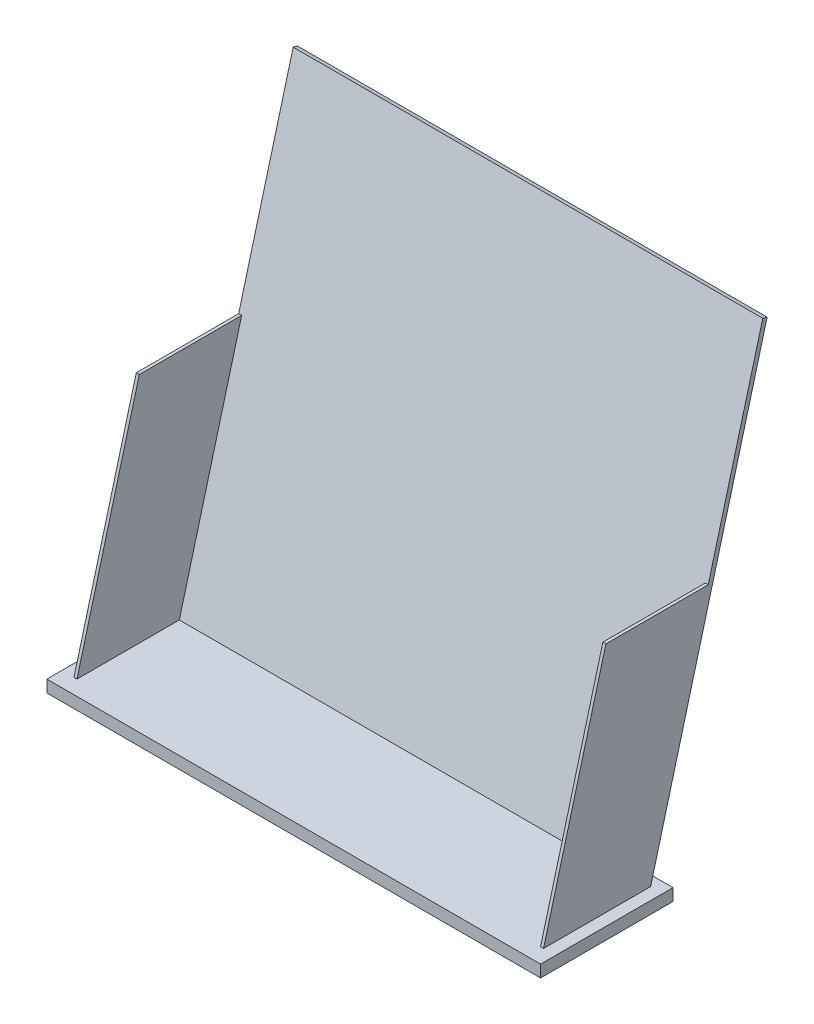
ISO-10303-21;
HEADER;
FILE_DESCRIPTION(('STEP AP214'),'2;1');
FILE_NAME('part.step','',(''),(''),'','','');
FILE_SCHEMA(('AUTOMOTIVE_DESIGN { 1 0 10303 214 1 1 1 1 }'));
ENDSEC;
DATA;
#1=APPLICATION_CONTEXT('core data for automotive mechanical design processes');
#2=APPLICATION_PROTOCOL_DEFINITION('international standard','automotive_design',2000,#1);
#3=PRODUCT_CONTEXT('',#1,'mechanical');
#4=PRODUCT('Part','Part','',(#3));
#5=PRODUCT_RELATED_PRODUCT_CATEGORY('part','',(#4));
#6=PRODUCT_DEFINITION_FORMATION('','',#4);
#7=PRODUCT_DEFINITION_CONTEXT('part definition',#1,'design');
#8=PRODUCT_DEFINITION('design','',#6,#7);
#9=PRODUCT_DEFINITION_SHAPE('','',#8);
#10=(LENGTH_UNIT() NAMED_UNIT(*) SI_UNIT(.MILLI.,.METRE.));
#11=(NAMED_UNIT(*) PLANE_ANGLE_UNIT() SI_UNIT($,.RADIAN.));
#12=(NAMED_UNIT(*) SI_UNIT($,.STERADIAN.) SOLID_ANGLE_UNIT());
#13=UNCERTAINTY_MEASURE_WITH_UNIT(LENGTH_MEASURE(1.E-05),#10,'distance_accuracy_value','');
#14=(GEOMETRIC_REPRESENTATION_CONTEXT(3) GLOBAL_UNCERTAINTY_ASSIGNED_CONTEXT((#13)) GLOBAL_UNIT_ASSIGNED_CONTEXT((#10,
#11,#12)) REPRESENTATION_CONTEXT('',''));
#15=CARTESIAN_POINT('',(0.,0.,0.));
#16=DIRECTION('',(0.,0.,1.));
#17=DIRECTION('',(1.,0.,0.));
#18=AXIS2_PLACEMENT_3D('',#15,#16,#17);
#19=CARTESIAN_POINT('',(0.,2.,0.));
#20=DIRECTION('',(0.,1.,0.));
#21=DIRECTION('',(0.,0.,1.));
#22=AXIS2_PLACEMENT_3D('',#19,#20,#21);
#23=PLANE('',#22);
#24=DIRECTION('',(0.,0.,-1.));
#25=VECTOR('',#24,1.);
#26=CARTESIAN_POINT('',(41.,2.,-11.));
#27=LINE('',#26,#25);
#28=CARTESIAN_POINT('',(41.,2.,11.));
#29=VERTEX_POINT('',#28);
#30=CARTESIAN_POINT('',(41.,2.,-11.));
#31=VERTEX_POINT('',#30);
#32=EDGE_CURVE('E169',#29,#31,#27,.T.);
#33=ORIENTED_EDGE('',*,*,#32,.T.);
#34=DIRECTION('',(-1.,0.,0.));
#35=VECTOR('',#34,1.);
#36=CARTESIAN_POINT('',(-41.,2.,-11.));
#37=LINE('',#36,#35);
#38=CARTESIAN_POINT('',(-41.,2.,-11.));
#39=VERTEX_POINT('',#38);
#40=EDGE_CURVE('E172',#31,#39,#37,.T.);
#41=ORIENTED_EDGE('',*,*,#40,.T.);
#42=DIRECTION('',(0.,0.,1.));
#43=VECTOR('',#42,1.);
#44=CARTESIAN_POINT('',(-41.,2.,-11.));
#45=LINE('',#44,#43);
#46=CARTESIAN_POINT('',(-41.,2.,11.));
#47=VERTEX_POINT('',#46);
#48=EDGE_CURVE('E175',#39,#47,#45,.T.);
#49=ORIENTED_EDGE('',*,*,#48,.T.);
#50=DIRECTION('',(1.,0.,0.));
#51=VECTOR('',#50,1.);
#52=CARTESIAN_POINT('',(-41.,2.,11.));
#53=LINE('',#52,#51);
#54=EDGE_CURVE('E177',#47,#29,#53,.T.);
#55=ORIENTED_EDGE('',*,*,#54,.T.);
#56=EDGE_LOOP('',(#33,#41,#49,#55));
#57=FACE_BOUND('',#56,.T.);
#58=DIRECTION('',(-1.,0.,0.));
#59=VECTOR('',#58,1.);
#60=CARTESIAN_POINT('',(39.,2.,-8.5));
#61=LINE('',#60,#59);
#62=CARTESIAN_POINT('',(38.5,2.,-8.5));
#63=VERTEX_POINT('',#62);
#64=CARTESIAN_POINT('',(-38.5,2.,-8.5));
#65=VERTEX_POINT('',#64);
#66=EDGE_CURVE('E148',#63,#65,#61,.T.);
#67=ORIENTED_EDGE('',*,*,#66,.T.);
#68=DIRECTION('',(0.,0.,-1.));
#69=VECTOR('',#68,1.);
#70=CARTESIAN_POINT('',(-38.5,2.,-8.5));
#71=LINE('',#70,#69);
#72=CARTESIAN_POINT('',(-38.5,2.,8.5));
#73=VERTEX_POINT('',#72);
#74=EDGE_CURVE('E131',#73,#65,#71,.T.);
#75=ORIENTED_EDGE('',*,*,#74,.F.);
#76=DIRECTION('',(-1.,0.,0.));
#77=VECTOR('',#76,1.);
#78=CARTESIAN_POINT('',(-38.5,2.,8.5));
#79=LINE('',#78,#77);
#80=CARTESIAN_POINT('',(-39.,2.,8.5));
#81=VERTEX_POINT('',#80);
#82=EDGE_CURVE('E258',#73,#81,#79,.T.);
#83=ORIENTED_EDGE('',*,*,#82,.T.);
#84=DIRECTION('',(0.,0.,1.));
#85=VECTOR('',#84,1.);
#86=CARTESIAN_POINT('',(-39.,2.,0.));
#87=LINE('',#86,#85);
#88=CARTESIAN_POINT('',(-39.,2.,-9.27645713530756));
#89=VERTEX_POINT('',#88);
#90=EDGE_CURVE('E198',#89,#81,#87,.T.);
#91=ORIENTED_EDGE('',*,*,#90,.F.);
#92=DIRECTION('',(1.,0.,0.));
#93=VECTOR('',#92,1.);
#94=CARTESIAN_POINT('',(0.,2.,-9.27645713530756));
#95=LINE('',#94,#93);
#96=CARTESIAN_POINT('',(39.,2.,-9.27645713530756));
#97=VERTEX_POINT('',#96);
#98=EDGE_CURVE('E40',#89,#97,#95,.T.);
#99=ORIENTED_EDGE('',*,*,#98,.T.);
#100=DIRECTION('',(0.,0.,1.));
#101=VECTOR('',#100,1.);
#102=CARTESIAN_POINT('',(39.,2.,0.));
#103=LINE('',#102,#101);
#104=CARTESIAN_POINT('',(39.,2.,8.5));
#105=VERTEX_POINT('',#104);
#106=EDGE_CURVE('E11',#97,#105,#103,.T.);
#107=ORIENTED_EDGE('',*,*,#106,.T.);
#108=DIRECTION('',(1.,0.,0.));
#109=VECTOR('',#108,1.);
#110=CARTESIAN_POINT('',(38.5,2.,8.5));
#111=LINE('',#110,#109);
#112=CARTESIAN_POINT('',(38.5,2.,8.5));
#113=VERTEX_POINT('',#112);
#114=EDGE_CURVE('E54',#113,#105,#111,.T.);
#115=ORIENTED_EDGE('',*,*,#114,.F.);
#116=DIRECTION('',(0.,0.,-1.));
#117=VECTOR('',#116,1.);
#118=CARTESIAN_POINT('',(38.5,2.,-8.5));
#119=LINE('',#118,#117);
#120=EDGE_CURVE('E153',#113,#63,#119,.T.);
#121=ORIENTED_EDGE('',*,*,#120,.T.);
#122=EDGE_LOOP('',(#67,#75,#83,#91,#99,#107,#115,#121));
#123=FACE_BOUND('',#122,.T.);
#124=ADVANCED_FACE('F32',(#57,#123),#23,.T.);
#125=CARTESIAN_POINT('',(39.,2.,-8.5));
#126=DIRECTION('',(0.,0.258819045102518,0.965925826289069));
#127=DIRECTION('',(0.,-0.965925826289069,0.258819045102518));
#128=AXIS2_PLACEMENT_3D('',#125,#126,#127);
#129=PLANE('',#128);
#130=DIRECTION('',(0.,0.965925826289069,-0.258819045102518));
#131=VECTOR('',#130,1.);
#132=CARTESIAN_POINT('',(-39.,2.,-8.5));
#133=LINE('',#132,#131);
#134=CARTESIAN_POINT('',(-39.,40.6370330515628,-18.8527618041007));
#135=VERTEX_POINT('',#134);
#136=CARTESIAN_POINT('',(-39.,74.4444369716802,-27.9114283826889));
#137=VERTEX_POINT('',#136);
#138=EDGE_CURVE('E163',#135,#137,#133,.T.);
#139=ORIENTED_EDGE('',*,*,#138,.F.);
#140=DIRECTION('',(-1.,0.,0.));
#141=VECTOR('',#140,1.);
#142=CARTESIAN_POINT('',(-38.5,40.6370330515628,-18.8527618041007));
#143=LINE('',#142,#141);
#144=CARTESIAN_POINT('',(-38.5,40.6370330515628,-18.8527618041007));
#145=VERTEX_POINT('',#144);
#146=EDGE_CURVE('E150',#145,#135,#143,.T.);
#147=ORIENTED_EDGE('',*,*,#146,.F.);
#148=DIRECTION('',(0.,0.965925826289069,-0.258819045102518));
#149=VECTOR('',#148,1.);
#150=CARTESIAN_POINT('',(-38.5,40.6370330515628,-18.8527618041007));
#151=LINE('',#150,#149);
#152=EDGE_CURVE('E134',#65,#145,#151,.T.);
#153=ORIENTED_EDGE('',*,*,#152,.F.);
#154=ORIENTED_EDGE('',*,*,#66,.F.);
#155=DIRECTION('',(0.,0.965925826289069,-0.258819045102518));
#156=VECTOR('',#155,1.);
#157=CARTESIAN_POINT('',(38.5,40.6370330515628,-18.8527618041007));
#158=LINE('',#157,#156);
#159=CARTESIAN_POINT('',(38.5,40.6370330515628,-18.8527618041007));
#160=VERTEX_POINT('',#159);
#161=EDGE_CURVE('E233',#63,#160,#158,.T.);
#162=ORIENTED_EDGE('',*,*,#161,.T.);
#163=DIRECTION('',(1.,0.,0.));
#164=VECTOR('',#163,1.);
#165=CARTESIAN_POINT('',(38.5,40.6370330515628,-18.8527618041007));
#166=LINE('',#165,#164);
#167=CARTESIAN_POINT('',(39.,40.6370330515628,-18.8527618041007));
#168=VERTEX_POINT('',#167);
#169=EDGE_CURVE('E219',#160,#168,#166,.T.);
#170=ORIENTED_EDGE('',*,*,#169,.T.);
#171=DIRECTION('',(0.,0.965925826289069,-0.258819045102518));
#172=VECTOR('',#171,1.);
#173=CARTESIAN_POINT('',(39.,2.,-8.5));
#174=LINE('',#173,#172);
#175=CARTESIAN_POINT('',(39.,74.4444369716802,-27.9114283826889));
#176=VERTEX_POINT('',#175);
#177=EDGE_CURVE('E155',#168,#176,#174,.T.);
#178=ORIENTED_EDGE('',*,*,#177,.T.);
#179=DIRECTION('',(-1.,0.,0.));
#180=VECTOR('',#179,1.);
#181=CARTESIAN_POINT('',(39.,74.4444369716802,-27.9114283826889));
#182=LINE('',#181,#180);
#183=EDGE_CURVE('E154',#176,#137,#182,.T.);
#184=ORIENTED_EDGE('',*,*,#183,.T.);
#185=EDGE_LOOP('',(#139,#147,#153,#154,#162,#170,#178,#184));
#186=FACE_BOUND('',#185,.T.);
#187=ADVANCED_FACE('F147',(#186),#129,.T.);
#188=CARTESIAN_POINT('',(41.,2.,-11.));
#189=DIRECTION('',(-1.,0.,0.));
#190=DIRECTION('',(0.,0.,1.));
#191=AXIS2_PLACEMENT_3D('',#188,#189,#190);
#192=PLANE('',#191);
#193=DIRECTION('',(0.,0.,-1.));
#194=VECTOR('',#193,1.);
#195=CARTESIAN_POINT('',(41.,0.,-11.));
#196=LINE('',#195,#194);
#197=CARTESIAN_POINT('',(41.,0.,11.));
#198=VERTEX_POINT('',#197);
#199=CARTESIAN_POINT('',(41.,0.,-11.));
#200=VERTEX_POINT('',#199);
#201=EDGE_CURVE('E168',#198,#200,#196,.T.);
#202=ORIENTED_EDGE('',*,*,#201,.T.);
#203=DIRECTION('',(0.,-1.,0.));
#204=VECTOR('',#203,1.);
#205=CARTESIAN_POINT('',(41.,2.,-11.));
#206=LINE('',#205,#204);
#207=EDGE_CURVE('E195',#31,#200,#206,.T.);
#208=ORIENTED_EDGE('',*,*,#207,.F.);
#209=ORIENTED_EDGE('',*,*,#32,.F.);
#210=DIRECTION('',(0.,-1.,0.));
#211=VECTOR('',#210,1.);
#212=CARTESIAN_POINT('',(41.,2.,11.));
#213=LINE('',#212,#211);
#214=EDGE_CURVE('E179',#29,#198,#213,.T.);
#215=ORIENTED_EDGE('',*,*,#214,.T.);
#216=EDGE_LOOP('',(#202,#208,#209,#215));
#217=FACE_BOUND('',#216,.T.);
#218=ADVANCED_FACE('F34',(#217),#192,.F.);
#219=CARTESIAN_POINT('',(-41.,2.,-11.));
#220=DIRECTION('',(0.,0.,1.));
#221=DIRECTION('',(1.,0.,0.));
#222=AXIS2_PLACEMENT_3D('',#219,#220,#221);
#223=PLANE('',#222);
#224=DIRECTION('',(-1.,0.,0.));
#225=VECTOR('',#224,1.);
#226=CARTESIAN_POINT('',(-41.,0.,-11.));
#227=LINE('',#226,#225);
#228=CARTESIAN_POINT('',(-41.,0.,-11.));
#229=VERTEX_POINT('',#228);
#230=EDGE_CURVE('E182',#200,#229,#227,.T.);
#231=ORIENTED_EDGE('',*,*,#230,.T.);
#232=DIRECTION('',(0.,-1.,0.));
#233=VECTOR('',#232,1.);
#234=CARTESIAN_POINT('',(-41.,2.,-11.));
#235=LINE('',#234,#233);
#236=EDGE_CURVE('E192',#39,#229,#235,.T.);
#237=ORIENTED_EDGE('',*,*,#236,.F.);
#238=ORIENTED_EDGE('',*,*,#40,.F.);
#239=ORIENTED_EDGE('',*,*,#207,.T.);
#240=EDGE_LOOP('',(#231,#237,#238,#239));
#241=FACE_BOUND('',#240,.T.);
#242=ADVANCED_FACE('F298',(#241),#223,.F.);
#243=CARTESIAN_POINT('',(-41.,2.,-11.));
#244=DIRECTION('',(1.,0.,0.));
#245=DIRECTION('',(0.,0.,-1.));
#246=AXIS2_PLACEMENT_3D('',#243,#244,#245);
#247=PLANE('',#246);
#248=DIRECTION('',(0.,0.,1.));
#249=VECTOR('',#248,1.);
#250=CARTESIAN_POINT('',(-41.,0.,-11.));
#251=LINE('',#250,#249);
#252=CARTESIAN_POINT('',(-41.,0.,11.));
#253=VERTEX_POINT('',#252);
#254=EDGE_CURVE('E184',#229,#253,#251,.T.);
#255=ORIENTED_EDGE('',*,*,#254,.T.);
#256=DIRECTION('',(0.,-1.,0.));
#257=VECTOR('',#256,1.);
#258=CARTESIAN_POINT('',(-41.,2.,11.));
#259=LINE('',#258,#257);
#260=EDGE_CURVE('E189',#47,#253,#259,.T.);
#261=ORIENTED_EDGE('',*,*,#260,.F.);
#262=ORIENTED_EDGE('',*,*,#48,.F.);
#263=ORIENTED_EDGE('',*,*,#236,.T.);
#264=EDGE_LOOP('',(#255,#261,#262,#263));
#265=FACE_BOUND('',#264,.T.);
#266=ADVANCED_FACE('F295',(#265),#247,.F.);
#267=CARTESIAN_POINT('',(-41.,2.,11.));
#268=DIRECTION('',(0.,0.,-1.));
#269=DIRECTION('',(-1.,0.,0.));
#270=AXIS2_PLACEMENT_3D('',#267,#268,#269);
#271=PLANE('',#270);
#272=DIRECTION('',(1.,0.,0.));
#273=VECTOR('',#272,1.);
#274=CARTESIAN_POINT('',(-41.,0.,11.));
#275=LINE('',#274,#273);
#276=EDGE_CURVE('E173',#253,#198,#275,.T.);
#277=ORIENTED_EDGE('',*,*,#276,.T.);
#278=ORIENTED_EDGE('',*,*,#214,.F.);
#279=ORIENTED_EDGE('',*,*,#54,.F.);
#280=ORIENTED_EDGE('',*,*,#260,.T.);
#281=EDGE_LOOP('',(#277,#278,#279,#280));
#282=FACE_BOUND('',#281,.T.);
#283=ADVANCED_FACE('F291',(#282),#271,.F.);
#284=CARTESIAN_POINT('',(0.,0.,0.));
#285=DIRECTION('',(0.,1.,0.));
#286=DIRECTION('',(0.,0.,1.));
#287=AXIS2_PLACEMENT_3D('',#284,#285,#286);
#288=PLANE('',#287);
#289=ORIENTED_EDGE('',*,*,#201,.F.);
#290=ORIENTED_EDGE('',*,*,#276,.F.);
#291=ORIENTED_EDGE('',*,*,#254,.F.);
#292=ORIENTED_EDGE('',*,*,#230,.F.);
#293=EDGE_LOOP('',(#289,#290,#291,#292));
#294=FACE_BOUND('',#293,.T.);
#295=ADVANCED_FACE('F288',(#294),#288,.F.);
#296=CARTESIAN_POINT('',(39.,1.80588571617311,-9.2244443697168));
#297=DIRECTION('',(0.,0.258819045102518,0.965925826289069));
#298=DIRECTION('',(0.,-0.965925826289069,0.258819045102518));
#299=AXIS2_PLACEMENT_3D('',#296,#297,#298);
#300=PLANE('',#299);
#301=ORIENTED_EDGE('',*,*,#98,.F.);
#302=DIRECTION('',(0.,0.965925826289069,-0.258819045102518));
#303=VECTOR('',#302,1.);
#304=CARTESIAN_POINT('',(-39.,1.80588571617311,-9.2244443697168));
#305=LINE('',#304,#303);
#306=CARTESIAN_POINT('',(-39.,74.2503226878533,-28.6358727524057));
#307=VERTEX_POINT('',#306);
#308=EDGE_CURVE('E222',#89,#307,#305,.T.);
#309=ORIENTED_EDGE('',*,*,#308,.T.);
#310=DIRECTION('',(-1.,0.,0.));
#311=VECTOR('',#310,1.);
#312=CARTESIAN_POINT('',(39.,74.2503226878533,-28.6358727524057));
#313=LINE('',#312,#311);
#314=CARTESIAN_POINT('',(39.,74.2503226878533,-28.6358727524057));
#315=VERTEX_POINT('',#314);
#316=EDGE_CURVE('E158',#315,#307,#313,.T.);
#317=ORIENTED_EDGE('',*,*,#316,.F.);
#318=DIRECTION('',(0.,0.965925826289069,-0.258819045102518));
#319=VECTOR('',#318,1.);
#320=CARTESIAN_POINT('',(39.,1.80588571617311,-9.2244443697168));
#321=LINE('',#320,#319);
#322=EDGE_CURVE('E208',#97,#315,#321,.T.);
#323=ORIENTED_EDGE('',*,*,#322,.F.);
#324=EDGE_LOOP('',(#301,#309,#317,#323));
#325=FACE_BOUND('',#324,.T.);
#326=ADVANCED_FACE('F213',(#325),#300,.F.);
#327=CARTESIAN_POINT('',(39.,74.4444369716802,-27.9114283826889));
#328=DIRECTION('',(0.,0.965925826289074,-0.258819045102499));
#329=DIRECTION('',(0.,0.258819045102499,0.965925826289074));
#330=AXIS2_PLACEMENT_3D('',#327,#328,#329);
#331=PLANE('',#330);
#332=DIRECTION('',(0.,-0.258819045102499,-0.965925826289074));
#333=VECTOR('',#332,1.);
#334=CARTESIAN_POINT('',(-39.,74.4444369716802,-27.9114283826889));
#335=LINE('',#334,#333);
#336=EDGE_CURVE('E217',#137,#307,#335,.T.);
#337=ORIENTED_EDGE('',*,*,#336,.F.);
#338=ORIENTED_EDGE('',*,*,#183,.F.);
#339=DIRECTION('',(0.,-0.258819045102499,-0.965925826289074));
#340=VECTOR('',#339,1.);
#341=CARTESIAN_POINT('',(39.,74.4444369716802,-27.9114283826889));
#342=LINE('',#341,#340);
#343=EDGE_CURVE('E160',#176,#315,#342,.T.);
#344=ORIENTED_EDGE('',*,*,#343,.T.);
#345=ORIENTED_EDGE('',*,*,#316,.T.);
#346=EDGE_LOOP('',(#337,#338,#344,#345));
#347=FACE_BOUND('',#346,.T.);
#348=ADVANCED_FACE('F228',(#347),#331,.T.);
#349=CARTESIAN_POINT('',(39.,0.,0.));
#350=DIRECTION('',(-1.,0.,0.));
#351=DIRECTION('',(0.,0.,1.));
#352=AXIS2_PLACEMENT_3D('',#349,#350,#351);
#353=PLANE('',#352);
#354=ORIENTED_EDGE('',*,*,#106,.F.);
#355=ORIENTED_EDGE('',*,*,#322,.T.);
#356=ORIENTED_EDGE('',*,*,#343,.F.);
#357=ORIENTED_EDGE('',*,*,#177,.F.);
#358=DIRECTION('',(0.,0.,1.));
#359=VECTOR('',#358,1.);
#360=CARTESIAN_POINT('',(39.,40.6370330515628,-1.85276180410071));
#361=LINE('',#360,#359);
#362=CARTESIAN_POINT('',(39.,40.6370330515628,-1.85276180410071));
#363=VERTEX_POINT('',#362);
#364=EDGE_CURVE('E231',#168,#363,#361,.T.);
#365=ORIENTED_EDGE('',*,*,#364,.T.);
#366=DIRECTION('',(0.,-0.965925826289069,0.258819045102518));
#367=VECTOR('',#366,1.);
#368=CARTESIAN_POINT('',(39.,2.,8.5));
#369=LINE('',#368,#367);
#370=EDGE_CURVE('E212',#363,#105,#369,.T.);
#371=ORIENTED_EDGE('',*,*,#370,.T.);
#372=EDGE_LOOP('',(#354,#355,#356,#357,#365,#371));
#373=FACE_BOUND('',#372,.T.);
#374=ADVANCED_FACE('F206',(#373),#353,.F.);
#375=CARTESIAN_POINT('',(-39.,0.,0.));
#376=DIRECTION('',(-1.,0.,0.));
#377=DIRECTION('',(0.,0.,1.));
#378=AXIS2_PLACEMENT_3D('',#375,#376,#377);
#379=PLANE('',#378);
#380=ORIENTED_EDGE('',*,*,#308,.F.);
#381=ORIENTED_EDGE('',*,*,#90,.T.);
#382=DIRECTION('',(0.,-0.965925826289069,0.258819045102518));
#383=VECTOR('',#382,1.);
#384=CARTESIAN_POINT('',(-39.,2.,8.5));
#385=LINE('',#384,#383);
#386=CARTESIAN_POINT('',(-39.,40.6370330515628,-1.85276180410071));
#387=VERTEX_POINT('',#386);
#388=EDGE_CURVE('E141',#387,#81,#385,.T.);
#389=ORIENTED_EDGE('',*,*,#388,.F.);
#390=DIRECTION('',(0.,0.,1.));
#391=VECTOR('',#390,1.);
#392=CARTESIAN_POINT('',(-39.,40.6370330515628,-1.85276180410071));
#393=LINE('',#392,#391);
#394=EDGE_CURVE('E47',#135,#387,#393,.T.);
#395=ORIENTED_EDGE('',*,*,#394,.F.);
#396=ORIENTED_EDGE('',*,*,#138,.T.);
#397=ORIENTED_EDGE('',*,*,#336,.T.);
#398=EDGE_LOOP('',(#380,#381,#389,#395,#396,#397));
#399=FACE_BOUND('',#398,.T.);
#400=ADVANCED_FACE('F225',(#399),#379,.T.);
#401=CARTESIAN_POINT('',(38.5,2.,8.5));
#402=DIRECTION('',(0.,0.258819045102518,0.965925826289069));
#403=DIRECTION('',(0.,-0.965925826289069,0.258819045102518));
#404=AXIS2_PLACEMENT_3D('',#401,#402,#403);
#405=PLANE('',#404);
#406=ORIENTED_EDGE('',*,*,#370,.F.);
#407=DIRECTION('',(1.,0.,0.));
#408=VECTOR('',#407,1.);
#409=CARTESIAN_POINT('',(38.5,40.6370330515628,-1.85276180410071));
#410=LINE('',#409,#408);
#411=CARTESIAN_POINT('',(38.5,40.6370330515628,-1.85276180410071));
#412=VERTEX_POINT('',#411);
#413=EDGE_CURVE('E237',#412,#363,#410,.T.);
#414=ORIENTED_EDGE('',*,*,#413,.F.);
#415=DIRECTION('',(0.,-0.965925826289069,0.258819045102518));
#416=VECTOR('',#415,1.);
#417=CARTESIAN_POINT('',(38.5,2.,8.5));
#418=LINE('',#417,#416);
#419=EDGE_CURVE('E238',#412,#113,#418,.T.);
#420=ORIENTED_EDGE('',*,*,#419,.T.);
#421=ORIENTED_EDGE('',*,*,#114,.T.);
#422=EDGE_LOOP('',(#406,#414,#420,#421));
#423=FACE_BOUND('',#422,.T.);
#424=ADVANCED_FACE('F249',(#423),#405,.T.);
#425=CARTESIAN_POINT('',(38.5,40.6370330515628,-1.85276180410071));
#426=DIRECTION('',(0.,1.,0.));
#427=DIRECTION('',(0.,0.,1.));
#428=AXIS2_PLACEMENT_3D('',#425,#426,#427);
#429=PLANE('',#428);
#430=ORIENTED_EDGE('',*,*,#364,.F.);
#431=ORIENTED_EDGE('',*,*,#169,.F.);
#432=DIRECTION('',(0.,0.,1.));
#433=VECTOR('',#432,1.);
#434=CARTESIAN_POINT('',(38.5,40.6370330515628,-1.85276180410071));
#435=LINE('',#434,#433);
#436=EDGE_CURVE('E252',#160,#412,#435,.T.);
#437=ORIENTED_EDGE('',*,*,#436,.T.);
#438=ORIENTED_EDGE('',*,*,#413,.T.);
#439=EDGE_LOOP('',(#430,#431,#437,#438));
#440=FACE_BOUND('',#439,.T.);
#441=ADVANCED_FACE('F239',(#440),#429,.T.);
#442=CARTESIAN_POINT('',(38.5,0.,0.));
#443=DIRECTION('',(-1.,0.,0.));
#444=DIRECTION('',(0.,0.,1.));
#445=AXIS2_PLACEMENT_3D('',#442,#443,#444);
#446=PLANE('',#445);
#447=ORIENTED_EDGE('',*,*,#120,.F.);
#448=ORIENTED_EDGE('',*,*,#419,.F.);
#449=ORIENTED_EDGE('',*,*,#436,.F.);
#450=ORIENTED_EDGE('',*,*,#161,.F.);
#451=EDGE_LOOP('',(#447,#448,#449,#450));
#452=FACE_BOUND('',#451,.T.);
#453=ADVANCED_FACE('F276',(#452),#446,.T.);
#454=CARTESIAN_POINT('',(-38.5,40.6370330515628,-1.85276180410071));
#455=DIRECTION('',(0.,-1.,0.));
#456=DIRECTION('',(0.,0.,-1.));
#457=AXIS2_PLACEMENT_3D('',#454,#455,#456);
#458=PLANE('',#457);
#459=ORIENTED_EDGE('',*,*,#394,.T.);
#460=DIRECTION('',(-1.,0.,0.));
#461=VECTOR('',#460,1.);
#462=CARTESIAN_POINT('',(-38.5,40.6370330515628,-1.85276180410071));
#463=LINE('',#462,#461);
#464=CARTESIAN_POINT('',(-38.5,40.6370330515628,-1.85276180410071));
#465=VERTEX_POINT('',#464);
#466=EDGE_CURVE('E242',#465,#387,#463,.T.);
#467=ORIENTED_EDGE('',*,*,#466,.F.);
#468=DIRECTION('',(0.,0.,1.));
#469=VECTOR('',#468,1.);
#470=CARTESIAN_POINT('',(-38.5,40.6370330515628,-1.85276180410071));
#471=LINE('',#470,#469);
#472=EDGE_CURVE('E151',#145,#465,#471,.T.);
#473=ORIENTED_EDGE('',*,*,#472,.F.);
#474=ORIENTED_EDGE('',*,*,#146,.T.);
#475=EDGE_LOOP('',(#459,#467,#473,#474));
#476=FACE_BOUND('',#475,.T.);
#477=ADVANCED_FACE('F266',(#476),#458,.F.);
#478=CARTESIAN_POINT('',(-38.5,2.,8.5));
#479=DIRECTION('',(0.,-0.258819045102518,-0.965925826289069));
#480=DIRECTION('',(0.,0.965925826289069,-0.258819045102518));
#481=AXIS2_PLACEMENT_3D('',#478,#479,#480);
#482=PLANE('',#481);
#483=ORIENTED_EDGE('',*,*,#388,.T.);
#484=ORIENTED_EDGE('',*,*,#82,.F.);
#485=DIRECTION('',(0.,-0.965925826289069,0.258819045102518));
#486=VECTOR('',#485,1.);
#487=CARTESIAN_POINT('',(-38.5,2.,8.5));
#488=LINE('',#487,#486);
#489=EDGE_CURVE('E137',#465,#73,#488,.T.);
#490=ORIENTED_EDGE('',*,*,#489,.F.);
#491=ORIENTED_EDGE('',*,*,#466,.T.);
#492=EDGE_LOOP('',(#483,#484,#490,#491));
#493=FACE_BOUND('',#492,.T.);
#494=ADVANCED_FACE('F268',(#493),#482,.F.);
#495=CARTESIAN_POINT('',(-38.5,0.,0.));
#496=DIRECTION('',(-1.,0.,0.));
#497=DIRECTION('',(0.,0.,1.));
#498=AXIS2_PLACEMENT_3D('',#495,#496,#497);
#499=PLANE('',#498);
#500=ORIENTED_EDGE('',*,*,#74,.T.);
#501=ORIENTED_EDGE('',*,*,#152,.T.);
#502=ORIENTED_EDGE('',*,*,#472,.T.);
#503=ORIENTED_EDGE('',*,*,#489,.T.);
#504=EDGE_LOOP('',(#500,#501,#502,#503));
#505=FACE_BOUND('',#504,.T.);
#506=ADVANCED_FACE('F133',(#505),#499,.F.);
#507=CLOSED_SHELL('',(#124,#187,#218,#242,#266,#283,#295,#326,#348,#374,#400,#424,#441,#453,
#477,#494,#506));
#508=MANIFOLD_SOLID_BREP('B2',#507);
#509=ADVANCED_BREP_SHAPE_REPRESENTATION('',(#18,#508),#14);
#510=SHAPE_DEFINITION_REPRESENTATION(#9,#509);
ENDSEC;
END-ISO-10303-21;
